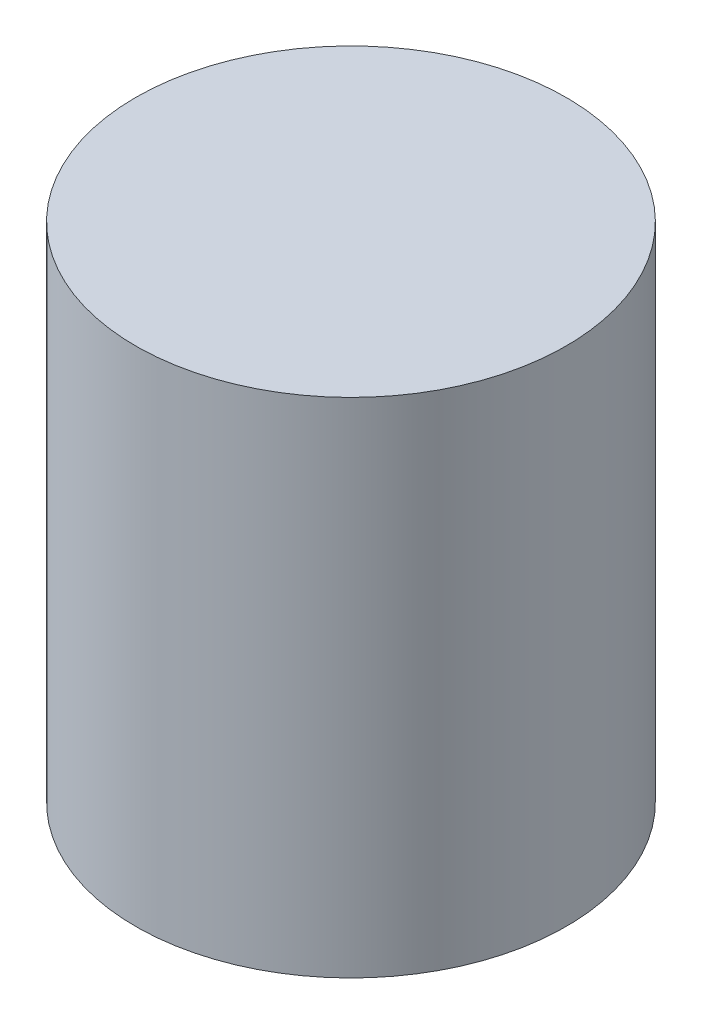
ISO-10303-21;
HEADER;
FILE_DESCRIPTION(('STEP AP214'),'2;1');
FILE_NAME('part.step','',(''),(''),'','','');
FILE_SCHEMA(('AUTOMOTIVE_DESIGN { 1 0 10303 214 1 1 1 1 }'));
ENDSEC;
DATA;
#1=APPLICATION_CONTEXT('core data for automotive mechanical design processes');
#2=APPLICATION_PROTOCOL_DEFINITION('international standard','automotive_design',2000,#1);
#3=PRODUCT_CONTEXT('',#1,'mechanical');
#4=PRODUCT('Part','Part','',(#3));
#5=PRODUCT_RELATED_PRODUCT_CATEGORY('part','',(#4));
#6=PRODUCT_DEFINITION_FORMATION('','',#4);
#7=PRODUCT_DEFINITION_CONTEXT('part definition',#1,'design');
#8=PRODUCT_DEFINITION('design','',#6,#7);
#9=PRODUCT_DEFINITION_SHAPE('','',#8);
#10=(LENGTH_UNIT() NAMED_UNIT(*) SI_UNIT(.MILLI.,.METRE.));
#11=(NAMED_UNIT(*) PLANE_ANGLE_UNIT() SI_UNIT($,.RADIAN.));
#12=(NAMED_UNIT(*) SI_UNIT($,.STERADIAN.) SOLID_ANGLE_UNIT());
#13=UNCERTAINTY_MEASURE_WITH_UNIT(LENGTH_MEASURE(1.E-05),#10,'distance_accuracy_value','');
#14=(GEOMETRIC_REPRESENTATION_CONTEXT(3) GLOBAL_UNCERTAINTY_ASSIGNED_CONTEXT((#13)) GLOBAL_UNIT_ASSIGNED_CONTEXT((#10,
#11,#12)) REPRESENTATION_CONTEXT('',''));
#15=CARTESIAN_POINT('',(0.,0.,0.));
#16=DIRECTION('',(0.,0.,1.));
#17=DIRECTION('',(1.,0.,0.));
#18=AXIS2_PLACEMENT_3D('',#15,#16,#17);
#19=CARTESIAN_POINT('',(14.984375,65.,0.));
#20=DIRECTION('',(0.,1.,0.));
#21=DIRECTION('',(0.,0.,-1.));
#22=AXIS2_PLACEMENT_3D('',#19,#20,#21);
#23=PLANE('',#22);
#24=CARTESIAN_POINT('',(14.984375,65.,0.));
#25=DIRECTION('',(0.,1.,0.));
#26=DIRECTION('',(1.,0.,0.));
#27=AXIS2_PLACEMENT_3D('',#24,#25,#26);
#28=CIRCLE('',#27,27.828125);
#29=CARTESIAN_POINT('',(-12.84375,65.,0.));
#30=VERTEX_POINT('',#29);
#31=EDGE_CURVE('E19',#30,#30,#28,.T.);
#32=ORIENTED_EDGE('',*,*,#31,.T.);
#33=EDGE_LOOP('',(#32));
#34=FACE_BOUND('',#33,.T.);
#35=ADVANCED_FACE('F16',(#34),#23,.T.);
#36=CARTESIAN_POINT('',(14.984375,0.,0.));
#37=DIRECTION('',(0.,-1.,0.));
#38=DIRECTION('',(-1.,0.,0.));
#39=AXIS2_PLACEMENT_3D('',#36,#37,#38);
#40=PLANE('',#39);
#41=CARTESIAN_POINT('',(14.984375,0.,0.));
#42=DIRECTION('',(0.,-1.,0.));
#43=DIRECTION('',(1.,0.,0.));
#44=AXIS2_PLACEMENT_3D('',#41,#42,#43);
#45=CIRCLE('',#44,27.828125);
#46=CARTESIAN_POINT('',(-12.84375,0.,0.));
#47=VERTEX_POINT('',#46);
#48=EDGE_CURVE('E10',#47,#47,#45,.T.);
#49=ORIENTED_EDGE('',*,*,#48,.T.);
#50=EDGE_LOOP('',(#49));
#51=FACE_BOUND('',#50,.T.);
#52=ADVANCED_FACE('F62',(#51),#40,.T.);
#53=CARTESIAN_POINT('',(14.984375,32.5,0.));
#54=DIRECTION('',(0.,1.,0.));
#55=DIRECTION('',(1.,0.,0.));
#56=AXIS2_PLACEMENT_3D('',#53,#54,#55);
#57=CYLINDRICAL_SURFACE('',#56,27.828125);
#58=ORIENTED_EDGE('',*,*,#31,.F.);
#59=DIRECTION('',(0.,-1.,0.));
#60=VECTOR('',#59,1.);
#61=CARTESIAN_POINT('',(-12.84375,32.5,0.));
#62=LINE('',#61,#60);
#63=EDGE_CURVE('E25',#30,#47,#62,.T.);
#64=ORIENTED_EDGE('',*,*,#63,.T.);
#65=ORIENTED_EDGE('',*,*,#48,.F.);
#66=ORIENTED_EDGE('',*,*,#63,.F.);
#67=EDGE_LOOP('',(#58,#64,#65,#66));
#68=FACE_BOUND('',#67,.T.);
#69=ADVANCED_FACE('F42',(#68),#57,.T.);
#70=CLOSED_SHELL('',(#35,#52,#69));
#71=MANIFOLD_SOLID_BREP('B1',#70);
#72=ADVANCED_BREP_SHAPE_REPRESENTATION('',(#18,#71),#14);
#73=SHAPE_DEFINITION_REPRESENTATION(#9,#72);
ENDSEC;
END-ISO-10303-21;
